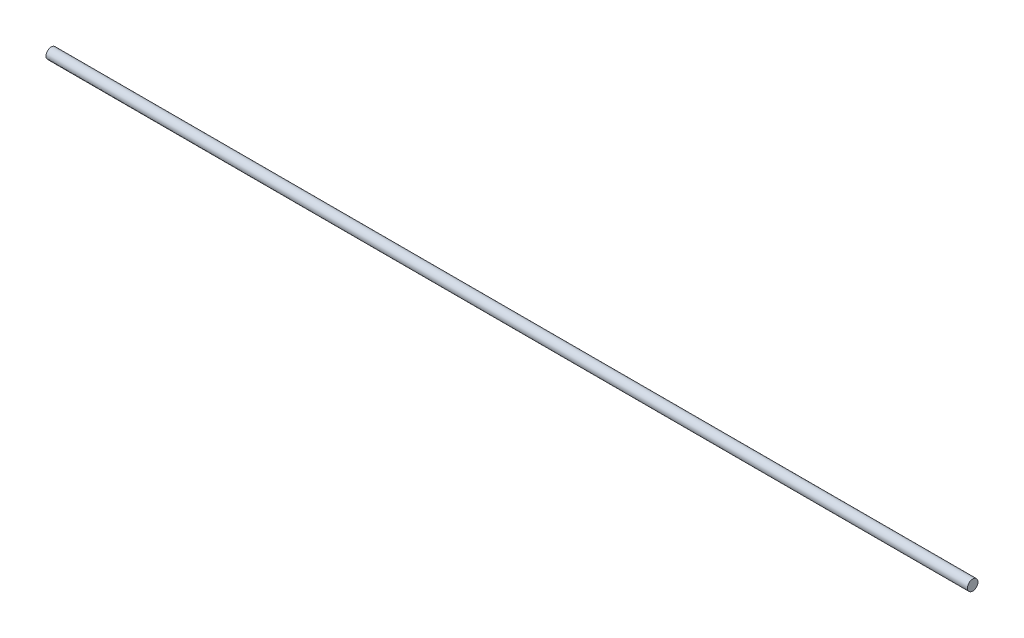
ISO-10303-21;
HEADER;
FILE_DESCRIPTION(('STEP AP214'),'2;1');
FILE_NAME('part.step','',(''),(''),'','','');
FILE_SCHEMA(('AUTOMOTIVE_DESIGN { 1 0 10303 214 1 1 1 1 }'));
ENDSEC;
DATA;
#1=APPLICATION_CONTEXT('core data for automotive mechanical design processes');
#2=APPLICATION_PROTOCOL_DEFINITION('international standard','automotive_design',2000,#1);
#3=PRODUCT_CONTEXT('',#1,'mechanical');
#4=PRODUCT('Part','Part','',(#3));
#5=PRODUCT_RELATED_PRODUCT_CATEGORY('part','',(#4));
#6=PRODUCT_DEFINITION_FORMATION('','',#4);
#7=PRODUCT_DEFINITION_CONTEXT('part definition',#1,'design');
#8=PRODUCT_DEFINITION('design','',#6,#7);
#9=PRODUCT_DEFINITION_SHAPE('','',#8);
#10=(LENGTH_UNIT() NAMED_UNIT(*) SI_UNIT(.MILLI.,.METRE.));
#11=(NAMED_UNIT(*) PLANE_ANGLE_UNIT() SI_UNIT($,.RADIAN.));
#12=(NAMED_UNIT(*) SI_UNIT($,.STERADIAN.) SOLID_ANGLE_UNIT());
#13=UNCERTAINTY_MEASURE_WITH_UNIT(LENGTH_MEASURE(1.E-05),#10,'distance_accuracy_value','');
#14=(GEOMETRIC_REPRESENTATION_CONTEXT(3) GLOBAL_UNCERTAINTY_ASSIGNED_CONTEXT((#13)) GLOBAL_UNIT_ASSIGNED_CONTEXT((#10,
#11,#12)) REPRESENTATION_CONTEXT('',''));
#15=CARTESIAN_POINT('',(0.,0.,0.));
#16=DIRECTION('',(0.,0.,1.));
#17=DIRECTION('',(1.,0.,0.));
#18=AXIS2_PLACEMENT_3D('',#15,#16,#17);
#19=CARTESIAN_POINT('',(700.,0.,0.));
#20=DIRECTION('',(-1.,0.,0.));
#21=DIRECTION('',(0.,0.,1.));
#22=AXIS2_PLACEMENT_3D('',#19,#20,#21);
#23=CYLINDRICAL_SURFACE('',#22,4.);
#24=CARTESIAN_POINT('',(700.,0.,0.));
#25=DIRECTION('',(1.,0.,0.));
#26=DIRECTION('',(0.,0.,-1.));
#27=AXIS2_PLACEMENT_3D('',#24,#25,#26);
#28=CIRCLE('',#27,4.);
#29=CARTESIAN_POINT('',(700.,0.,-4.));
#30=VERTEX_POINT('',#29);
#31=EDGE_CURVE('E10',#30,#30,#28,.T.);
#32=ORIENTED_EDGE('',*,*,#31,.F.);
#33=EDGE_LOOP('',(#32));
#34=FACE_BOUND('',#33,.T.);
#35=CARTESIAN_POINT('',(0.,0.,0.));
#36=DIRECTION('',(1.,0.,0.));
#37=DIRECTION('',(0.,0.,-1.));
#38=AXIS2_PLACEMENT_3D('',#35,#36,#37);
#39=CIRCLE('',#38,4.);
#40=CARTESIAN_POINT('',(0.,0.,-4.));
#41=VERTEX_POINT('',#40);
#42=EDGE_CURVE('E34',#41,#41,#39,.T.);
#43=ORIENTED_EDGE('',*,*,#42,.T.);
#44=EDGE_LOOP('',(#43));
#45=FACE_BOUND('',#44,.T.);
#46=ADVANCED_FACE('F31',(#34,#45),#23,.T.);
#47=CARTESIAN_POINT('',(700.,0.,0.));
#48=DIRECTION('',(1.,0.,0.));
#49=DIRECTION('',(0.,0.,-1.));
#50=AXIS2_PLACEMENT_3D('',#47,#48,#49);
#51=PLANE('',#50);
#52=ORIENTED_EDGE('',*,*,#31,.T.);
#53=EDGE_LOOP('',(#52));
#54=FACE_BOUND('',#53,.T.);
#55=ADVANCED_FACE('F46',(#54),#51,.T.);
#56=CARTESIAN_POINT('',(0.,0.,0.));
#57=DIRECTION('',(1.,0.,0.));
#58=DIRECTION('',(0.,0.,-1.));
#59=AXIS2_PLACEMENT_3D('',#56,#57,#58);
#60=PLANE('',#59);
#61=ORIENTED_EDGE('',*,*,#42,.F.);
#62=EDGE_LOOP('',(#61));
#63=FACE_BOUND('',#62,.T.);
#64=ADVANCED_FACE('F44',(#63),#60,.F.);
#65=CLOSED_SHELL('',(#46,#55,#64));
#66=MANIFOLD_SOLID_BREP('B2',#65);
#67=ADVANCED_BREP_SHAPE_REPRESENTATION('',(#18,#66),#14);
#68=SHAPE_DEFINITION_REPRESENTATION(#9,#67);
ENDSEC;
END-ISO-10303-21;
